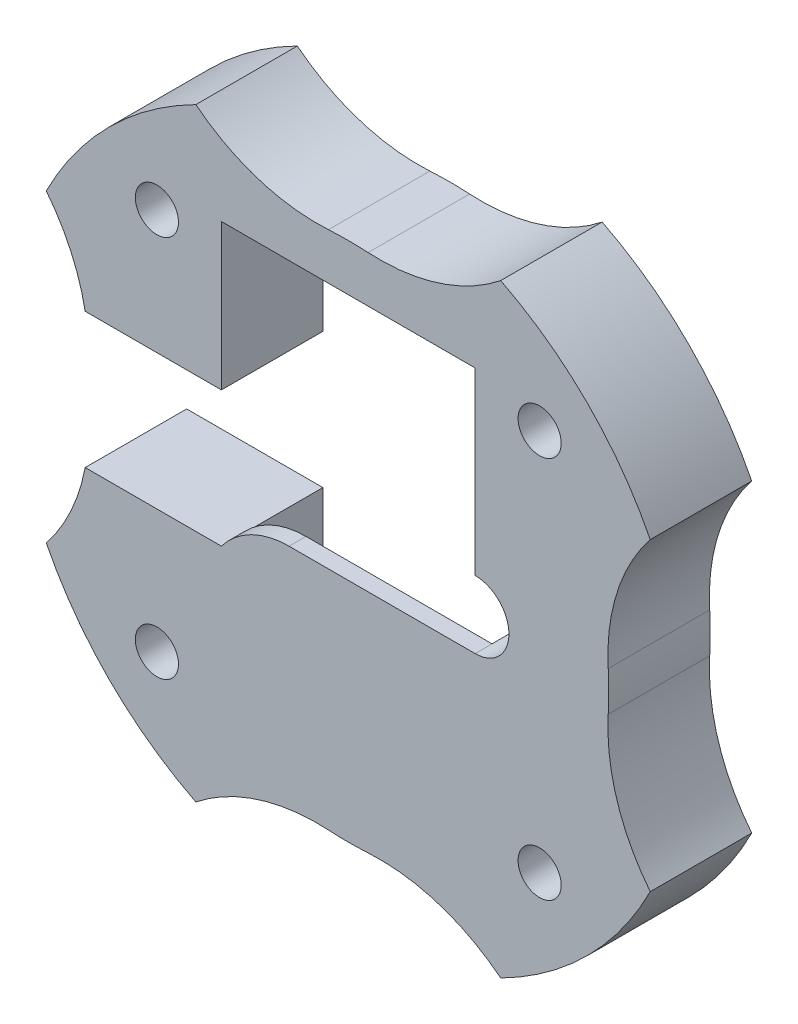
ISO-10303-21;
HEADER;
FILE_DESCRIPTION(('STEP AP214'),'2;1');
FILE_NAME('part.step','',(''),(''),'','','');
FILE_SCHEMA(('AUTOMOTIVE_DESIGN { 1 0 10303 214 1 1 1 1 }'));
ENDSEC;
DATA;
#1=APPLICATION_CONTEXT('core data for automotive mechanical design processes');
#2=APPLICATION_PROTOCOL_DEFINITION('international standard','automotive_design',2000,#1);
#3=PRODUCT_CONTEXT('',#1,'mechanical');
#4=PRODUCT('Part','Part','',(#3));
#5=PRODUCT_RELATED_PRODUCT_CATEGORY('part','',(#4));
#6=PRODUCT_DEFINITION_FORMATION('','',#4);
#7=PRODUCT_DEFINITION_CONTEXT('part definition',#1,'design');
#8=PRODUCT_DEFINITION('design','',#6,#7);
#9=PRODUCT_DEFINITION_SHAPE('','',#8);
#10=(LENGTH_UNIT() NAMED_UNIT(*) SI_UNIT(.MILLI.,.METRE.));
#11=(NAMED_UNIT(*) PLANE_ANGLE_UNIT() SI_UNIT($,.RADIAN.));
#12=(NAMED_UNIT(*) SI_UNIT($,.STERADIAN.) SOLID_ANGLE_UNIT());
#13=UNCERTAINTY_MEASURE_WITH_UNIT(LENGTH_MEASURE(1.E-05),#10,'distance_accuracy_value','');
#14=(GEOMETRIC_REPRESENTATION_CONTEXT(3) GLOBAL_UNCERTAINTY_ASSIGNED_CONTEXT((#13)) GLOBAL_UNIT_ASSIGNED_CONTEXT((#10,
#11,#12)) REPRESENTATION_CONTEXT('',''));
#15=CARTESIAN_POINT('',(0.,0.,0.));
#16=DIRECTION('',(0.,0.,1.));
#17=DIRECTION('',(1.,0.,0.));
#18=AXIS2_PLACEMENT_3D('',#15,#16,#17);
#19=CARTESIAN_POINT('',(-15.,245.749999993682,10.));
#20=DIRECTION('',(1.,0.,0.));
#21=DIRECTION('',(0.,1.,0.));
#22=AXIS2_PLACEMENT_3D('',#19,#20,#21);
#23=PLANE('',#22);
#24=DIRECTION('',(0.,-1.,0.));
#25=VECTOR('',#24,1.);
#26=CARTESIAN_POINT('',(-15.,245.749999993682,12.));
#27=LINE('',#26,#25);
#28=CARTESIAN_POINT('',(-15.,247.749999993682,12.));
#29=VERTEX_POINT('',#28);
#30=CARTESIAN_POINT('',(-15.,230.499999996841,12.));
#31=VERTEX_POINT('',#30);
#32=EDGE_CURVE('E476',#29,#31,#27,.T.);
#33=ORIENTED_EDGE('',*,*,#32,.T.);
#34=DIRECTION('',(0.,0.,-1.));
#35=VECTOR('',#34,1.);
#36=CARTESIAN_POINT('',(-15.,230.499999996841,19.));
#37=LINE('',#36,#35);
#38=CARTESIAN_POINT('',(-15.,230.499999996841,0.));
#39=VERTEX_POINT('',#38);
#40=EDGE_CURVE('E531',#31,#39,#37,.T.);
#41=ORIENTED_EDGE('',*,*,#40,.T.);
#42=DIRECTION('',(0.,-1.,0.));
#43=VECTOR('',#42,1.);
#44=CARTESIAN_POINT('',(-15.,245.749999993682,0.));
#45=LINE('',#44,#43);
#46=CARTESIAN_POINT('',(-15.,247.749999993682,0.));
#47=VERTEX_POINT('',#46);
#48=EDGE_CURVE('E267',#47,#39,#45,.T.);
#49=ORIENTED_EDGE('',*,*,#48,.F.);
#50=DIRECTION('',(0.,0.,1.));
#51=VECTOR('',#50,1.);
#52=CARTESIAN_POINT('',(-15.,247.749999993682,-23.));
#53=LINE('',#52,#51);
#54=EDGE_CURVE('E513',#47,#29,#53,.T.);
#55=ORIENTED_EDGE('',*,*,#54,.T.);
#56=EDGE_LOOP('',(#33,#41,#49,#55));
#57=FACE_BOUND('',#56,.T.);
#58=ADVANCED_FACE('F44',(#57),#23,.T.);
#59=CARTESIAN_POINT('',(26.8500979533182,220.651707524161,0.));
#60=DIRECTION('',(0.,0.,1.));
#61=DIRECTION('',(1.,0.,0.));
#62=AXIS2_PLACEMENT_3D('',#59,#60,#61);
#63=PLANE('',#62);
#64=CARTESIAN_POINT('',(-22.6274169979694,245.12741699481,0.));
#65=DIRECTION('',(0.,0.,1.));
#66=DIRECTION('',(1.,0.,0.));
#67=AXIS2_PLACEMENT_3D('',#64,#65,#66);
#68=CIRCLE('',#67,2.54999999999999);
#69=CARTESIAN_POINT('',(-20.0774169979694,245.12741699481,0.));
#70=VERTEX_POINT('',#69);
#71=EDGE_CURVE('E296',#70,#70,#68,.T.);
#72=ORIENTED_EDGE('',*,*,#71,.T.);
#73=EDGE_LOOP('',(#72));
#74=FACE_BOUND('',#73,.T.);
#75=CARTESIAN_POINT('',(-22.6274169979694,199.872582998871,0.));
#76=DIRECTION('',(0.,0.,1.));
#77=DIRECTION('',(1.,0.,0.));
#78=AXIS2_PLACEMENT_3D('',#75,#76,#77);
#79=CIRCLE('',#78,2.54999999999999);
#80=CARTESIAN_POINT('',(-20.0774169979694,199.872582998871,0.));
#81=VERTEX_POINT('',#80);
#82=EDGE_CURVE('E291',#81,#81,#79,.T.);
#83=ORIENTED_EDGE('',*,*,#82,.T.);
#84=EDGE_LOOP('',(#83));
#85=FACE_BOUND('',#84,.T.);
#86=CARTESIAN_POINT('',(22.6274169979694,199.872582998871,0.));
#87=DIRECTION('',(0.,0.,1.));
#88=DIRECTION('',(1.,0.,0.));
#89=AXIS2_PLACEMENT_3D('',#86,#87,#88);
#90=CIRCLE('',#89,2.55);
#91=CARTESIAN_POINT('',(25.1774169979694,199.872582998871,0.));
#92=VERTEX_POINT('',#91);
#93=EDGE_CURVE('E287',#92,#92,#90,.T.);
#94=ORIENTED_EDGE('',*,*,#93,.T.);
#95=EDGE_LOOP('',(#94));
#96=FACE_BOUND('',#95,.T.);
#97=CARTESIAN_POINT('',(22.6274169979694,245.127416994811,0.));
#98=DIRECTION('',(0.,0.,1.));
#99=DIRECTION('',(1.,0.,0.));
#100=AXIS2_PLACEMENT_3D('',#97,#98,#99);
#101=CIRCLE('',#100,2.55);
#102=CARTESIAN_POINT('',(25.1774169979694,245.127416994811,0.));
#103=VERTEX_POINT('',#102);
#104=EDGE_CURVE('E282',#103,#103,#101,.T.);
#105=ORIENTED_EDGE('',*,*,#104,.T.);
#106=EDGE_LOOP('',(#105));
#107=FACE_BOUND('',#106,.T.);
#108=DIRECTION('',(-1.,0.,0.));
#109=VECTOR('',#108,1.);
#110=CARTESIAN_POINT('',(-34.8095316654971,214.499999996841,0.));
#111=LINE('',#110,#109);
#112=CARTESIAN_POINT('',(-15.,214.499999996841,0.));
#113=VERTEX_POINT('',#112);
#114=CARTESIAN_POINT('',(-31.1071825324666,214.499999996841,0.));
#115=VERTEX_POINT('',#114);
#116=EDGE_CURVE('E222',#113,#115,#111,.T.);
#117=ORIENTED_EDGE('',*,*,#116,.F.);
#118=DIRECTION('',(0.,-1.,0.));
#119=VECTOR('',#118,1.);
#120=CARTESIAN_POINT('',(-15.,218.499999996841,0.));
#121=LINE('',#120,#119);
#122=CARTESIAN_POINT('',(-15.,199.25,0.));
#123=VERTEX_POINT('',#122);
#124=EDGE_CURVE('E232',#113,#123,#121,.T.);
#125=ORIENTED_EDGE('',*,*,#124,.T.);
#126=DIRECTION('',(1.,0.,0.));
#127=VECTOR('',#126,1.);
#128=CARTESIAN_POINT('',(-15.,199.25,0.));
#129=LINE('',#128,#127);
#130=CARTESIAN_POINT('',(15.,199.25,0.));
#131=VERTEX_POINT('',#130);
#132=EDGE_CURVE('E242',#123,#131,#129,.T.);
#133=ORIENTED_EDGE('',*,*,#132,.T.);
#134=DIRECTION('',(0.,1.,0.));
#135=VECTOR('',#134,1.);
#136=CARTESIAN_POINT('',(15.,199.25,0.));
#137=LINE('',#136,#135);
#138=CARTESIAN_POINT('',(15.,218.499999996841,0.));
#139=VERTEX_POINT('',#138);
#140=EDGE_CURVE('E249',#131,#139,#137,.T.);
#141=ORIENTED_EDGE('',*,*,#140,.T.);
#142=CARTESIAN_POINT('',(15.,222.499999996841,0.));
#143=DIRECTION('',(0.,0.,1.));
#144=DIRECTION('',(1.,0.,0.));
#145=AXIS2_PLACEMENT_3D('',#142,#143,#144);
#146=CIRCLE('',#145,4.);
#147=CARTESIAN_POINT('',(15.,226.499999996841,0.));
#148=VERTEX_POINT('',#147);
#149=EDGE_CURVE('E265',#139,#148,#146,.T.);
#150=ORIENTED_EDGE('',*,*,#149,.T.);
#151=DIRECTION('',(0.,1.,0.));
#152=VECTOR('',#151,1.);
#153=CARTESIAN_POINT('',(15.,226.499999996841,0.));
#154=LINE('',#153,#152);
#155=CARTESIAN_POINT('',(15.,247.749999993682,0.));
#156=VERTEX_POINT('',#155);
#157=EDGE_CURVE('E266',#148,#156,#154,.T.);
#158=ORIENTED_EDGE('',*,*,#157,.T.);
#159=DIRECTION('',(-1.,0.,0.));
#160=VECTOR('',#159,1.);
#161=CARTESIAN_POINT('',(26.8500979533182,247.749999993682,0.));
#162=LINE('',#161,#160);
#163=EDGE_CURVE('E512',#156,#47,#162,.T.);
#164=ORIENTED_EDGE('',*,*,#163,.T.);
#165=ORIENTED_EDGE('',*,*,#48,.T.);
#166=DIRECTION('',(1.,0.,0.));
#167=VECTOR('',#166,1.);
#168=CARTESIAN_POINT('',(-34.8095316654971,230.499999996841,0.));
#169=LINE('',#168,#167);
#170=CARTESIAN_POINT('',(-31.1071825324666,230.499999996841,0.));
#171=VERTEX_POINT('',#170);
#172=EDGE_CURVE('E230',#171,#39,#169,.T.);
#173=ORIENTED_EDGE('',*,*,#172,.F.);
#174=CARTESIAN_POINT('',(-53.7001959066365,226.1965849422,0.));
#175=DIRECTION('',(0.,0.,-1.));
#176=DIRECTION('',(1.,0.,0.));
#177=AXIS2_PLACEMENT_3D('',#174,#175,#176);
#178=CIRCLE('',#177,22.9992094311506);
#179=CARTESIAN_POINT('',(-35.7089622468441,240.524150885398,0.));
#180=VERTEX_POINT('',#179);
#181=EDGE_CURVE('E328',#180,#171,#178,.T.);
#182=ORIENTED_EDGE('',*,*,#181,.F.);
#183=CARTESIAN_POINT('',(0.,222.499999996841,0.));
#184=DIRECTION('',(0.,0.,1.));
#185=DIRECTION('',(1.,0.,0.));
#186=AXIS2_PLACEMENT_3D('',#183,#184,#185);
#187=CIRCLE('',#186,40.);
#188=CARTESIAN_POINT('',(-18.0241508885569,258.208962243685,0.));
#189=VERTEX_POINT('',#188);
#190=EDGE_CURVE('E326',#189,#180,#187,.T.);
#191=ORIENTED_EDGE('',*,*,#190,.F.);
#192=CARTESIAN_POINT('',(-3.69658494535899,276.200195903477,0.));
#193=DIRECTION('',(0.,0.,-1.));
#194=DIRECTION('',(1.,0.,0.));
#195=AXIS2_PLACEMENT_3D('',#192,#193,#194);
#196=CIRCLE('',#195,22.9992094311506);
#197=CARTESIAN_POINT('',(-2.34706751321945,253.240613216541,0.));
#198=VERTEX_POINT('',#197);
#199=EDGE_CURVE('E323',#198,#189,#196,.T.);
#200=ORIENTED_EDGE('',*,*,#199,.F.);
#201=CARTESIAN_POINT('',(0.,213.309531662338,0.));
#202=DIRECTION('',(0.,0.,1.));
#203=DIRECTION('',(1.,0.,0.));
#204=AXIS2_PLACEMENT_3D('',#201,#202,#203);
#205=CIRCLE('',#204,40.);
#206=CARTESIAN_POINT('',(2.34706751321958,253.240613216541,0.));
#207=VERTEX_POINT('',#206);
#208=EDGE_CURVE('E319',#207,#198,#205,.T.);
#209=ORIENTED_EDGE('',*,*,#208,.F.);
#210=CARTESIAN_POINT('',(3.69658494535932,276.200195903477,0.));
#211=DIRECTION('',(0.,0.,-1.));
#212=DIRECTION('',(1.,0.,0.));
#213=AXIS2_PLACEMENT_3D('',#210,#211,#212);
#214=CIRCLE('',#213,22.9992094311507);
#215=CARTESIAN_POINT('',(18.0241508885571,258.208962243685,0.));
#216=VERTEX_POINT('',#215);
#217=EDGE_CURVE('E320',#216,#207,#214,.T.);
#218=ORIENTED_EDGE('',*,*,#217,.F.);
#219=CARTESIAN_POINT('',(0.,222.499999996841,0.));
#220=DIRECTION('',(0.,0.,1.));
#221=DIRECTION('',(1.,0.,0.));
#222=AXIS2_PLACEMENT_3D('',#219,#220,#221);
#223=CIRCLE('',#222,40.);
#224=CARTESIAN_POINT('',(35.708962246844,240.524150885398,0.));
#225=VERTEX_POINT('',#224);
#226=EDGE_CURVE('E314',#225,#216,#223,.T.);
#227=ORIENTED_EDGE('',*,*,#226,.F.);
#228=CARTESIAN_POINT('',(53.7001959066364,226.1965849422,0.));
#229=DIRECTION('',(0.,0.,-1.));
#230=DIRECTION('',(1.,0.,0.));
#231=AXIS2_PLACEMENT_3D('',#228,#229,#230);
#232=CIRCLE('',#231,22.9992094311506);
#233=CARTESIAN_POINT('',(30.7406132196998,224.84706751006,0.));
#234=VERTEX_POINT('',#233);
#235=EDGE_CURVE('E313',#234,#225,#232,.T.);
#236=ORIENTED_EDGE('',*,*,#235,.F.);
#237=CARTESIAN_POINT('',(-9.19046833450298,222.499999996841,0.));
#238=DIRECTION('',(0.,0.,1.));
#239=DIRECTION('',(1.,0.,0.));
#240=AXIS2_PLACEMENT_3D('',#237,#238,#239);
#241=CIRCLE('',#240,40.);
#242=CARTESIAN_POINT('',(30.7406132196998,220.152932483621,0.));
#243=VERTEX_POINT('',#242);
#244=EDGE_CURVE('E306',#243,#234,#241,.T.);
#245=ORIENTED_EDGE('',*,*,#244,.F.);
#246=CARTESIAN_POINT('',(53.7001959066364,218.803415051482,0.));
#247=DIRECTION('',(0.,0.,-1.));
#248=DIRECTION('',(1.,0.,0.));
#249=AXIS2_PLACEMENT_3D('',#246,#247,#248);
#250=CIRCLE('',#249,22.9992094311507);
#251=CARTESIAN_POINT('',(35.708962246844,204.475849108284,0.));
#252=VERTEX_POINT('',#251);
#253=EDGE_CURVE('E304',#252,#243,#250,.T.);
#254=ORIENTED_EDGE('',*,*,#253,.F.);
#255=CARTESIAN_POINT('',(0.,222.499999996841,0.));
#256=DIRECTION('',(0.,0.,1.));
#257=DIRECTION('',(1.,0.,0.));
#258=AXIS2_PLACEMENT_3D('',#255,#256,#257);
#259=CIRCLE('',#258,40.);
#260=CARTESIAN_POINT('',(18.0241508885566,186.791037749997,0.));
#261=VERTEX_POINT('',#260);
#262=EDGE_CURVE('E301',#261,#252,#259,.T.);
#263=ORIENTED_EDGE('',*,*,#262,.F.);
#264=CARTESIAN_POINT('',(3.69658494535857,168.799804090204,0.));
#265=DIRECTION('',(0.,0.,-1.));
#266=DIRECTION('',(1.,0.,0.));
#267=AXIS2_PLACEMENT_3D('',#264,#265,#266);
#268=CIRCLE('',#267,22.9992094311506);
#269=CARTESIAN_POINT('',(2.34706751321916,191.759386777141,0.));
#270=VERTEX_POINT('',#269);
#271=EDGE_CURVE('E342',#270,#261,#268,.T.);
#272=ORIENTED_EDGE('',*,*,#271,.F.);
#273=CARTESIAN_POINT('',(0.,231.690468331344,0.));
#274=DIRECTION('',(0.,0.,1.));
#275=DIRECTION('',(1.,0.,0.));
#276=AXIS2_PLACEMENT_3D('',#273,#274,#275);
#277=CIRCLE('',#276,40.);
#278=CARTESIAN_POINT('',(-2.34706751321987,191.759386777141,0.));
#279=VERTEX_POINT('',#278);
#280=EDGE_CURVE('E341',#279,#270,#277,.T.);
#281=ORIENTED_EDGE('',*,*,#280,.F.);
#282=CARTESIAN_POINT('',(-3.69658494535974,168.799804090204,0.));
#283=DIRECTION('',(0.,0.,-1.));
#284=DIRECTION('',(1.,0.,0.));
#285=AXIS2_PLACEMENT_3D('',#282,#283,#284);
#286=CIRCLE('',#285,22.9992094311506);
#287=CARTESIAN_POINT('',(-18.0241508885574,186.791037749997,0.));
#288=VERTEX_POINT('',#287);
#289=EDGE_CURVE('E340',#288,#279,#286,.T.);
#290=ORIENTED_EDGE('',*,*,#289,.F.);
#291=CARTESIAN_POINT('',(0.,222.499999996841,0.));
#292=DIRECTION('',(0.,0.,1.));
#293=DIRECTION('',(1.,0.,0.));
#294=AXIS2_PLACEMENT_3D('',#291,#292,#293);
#295=CIRCLE('',#294,40.);
#296=CARTESIAN_POINT('',(-35.7089622468441,204.475849108284,0.));
#297=VERTEX_POINT('',#296);
#298=EDGE_CURVE('E333',#297,#288,#295,.T.);
#299=ORIENTED_EDGE('',*,*,#298,.F.);
#300=CARTESIAN_POINT('',(-53.7001959066365,218.803415051482,0.));
#301=DIRECTION('',(0.,0.,-1.));
#302=DIRECTION('',(1.,0.,0.));
#303=AXIS2_PLACEMENT_3D('',#300,#301,#302);
#304=CIRCLE('',#303,22.9992094311506);
#305=EDGE_CURVE('E240',#115,#297,#304,.T.);
#306=ORIENTED_EDGE('',*,*,#305,.F.);
#307=EDGE_LOOP('',(#117,#125,#133,#141,#150,#158,#164,#165,#173,#182,#191,#200,#209,#218,#227,
#236,#245,#254,#263,#272,#281,#290,#299,#306));
#308=FACE_BOUND('',#307,.T.);
#309=ADVANCED_FACE('F235',(#74,#85,#96,#107,#308),#63,.F.);
#310=CARTESIAN_POINT('',(0.,222.499999996841,10.));
#311=DIRECTION('',(0.,0.,-1.));
#312=DIRECTION('',(-1.,0.,0.));
#313=AXIS2_PLACEMENT_3D('',#310,#311,#312);
#314=CYLINDRICAL_SURFACE('',#313,40.);
#315=ORIENTED_EDGE('',*,*,#262,.T.);
#316=DIRECTION('',(0.,0.,-1.));
#317=VECTOR('',#316,1.);
#318=CARTESIAN_POINT('',(35.708962246844,204.475849108284,10.));
#319=LINE('',#318,#317);
#320=CARTESIAN_POINT('',(35.708962246844,204.475849108284,12.));
#321=VERTEX_POINT('',#320);
#322=EDGE_CURVE('E397',#321,#252,#319,.T.);
#323=ORIENTED_EDGE('',*,*,#322,.F.);
#324=CARTESIAN_POINT('',(0.,222.499999996841,12.));
#325=DIRECTION('',(0.,0.,1.));
#326=DIRECTION('',(1.,0.,0.));
#327=AXIS2_PLACEMENT_3D('',#324,#325,#326);
#328=CIRCLE('',#327,40.);
#329=CARTESIAN_POINT('',(18.0241508885566,186.791037749997,12.));
#330=VERTEX_POINT('',#329);
#331=EDGE_CURVE('E466',#330,#321,#328,.T.);
#332=ORIENTED_EDGE('',*,*,#331,.F.);
#333=DIRECTION('',(0.,0.,-1.));
#334=VECTOR('',#333,1.);
#335=CARTESIAN_POINT('',(18.0241508885566,186.791037749997,10.));
#336=LINE('',#335,#334);
#337=EDGE_CURVE('E350',#330,#261,#336,.T.);
#338=ORIENTED_EDGE('',*,*,#337,.T.);
#339=EDGE_LOOP('',(#315,#323,#332,#338));
#340=FACE_BOUND('',#339,.T.);
#341=ADVANCED_FACE('F600',(#340),#314,.T.);
#342=CARTESIAN_POINT('',(53.7001959066364,218.803415051482,10.));
#343=DIRECTION('',(0.,0.,-1.));
#344=DIRECTION('',(-1.,0.,0.));
#345=AXIS2_PLACEMENT_3D('',#342,#343,#344);
#346=CYLINDRICAL_SURFACE('',#345,22.9992094311507);
#347=ORIENTED_EDGE('',*,*,#253,.T.);
#348=DIRECTION('',(0.,0.,-1.));
#349=VECTOR('',#348,1.);
#350=CARTESIAN_POINT('',(30.7406132196998,220.152932483621,10.));
#351=LINE('',#350,#349);
#352=CARTESIAN_POINT('',(30.7406132196997,220.152932483621,12.));
#353=VERTEX_POINT('',#352);
#354=EDGE_CURVE('E392',#353,#243,#351,.T.);
#355=ORIENTED_EDGE('',*,*,#354,.F.);
#356=CARTESIAN_POINT('',(53.7001959066364,218.803415051482,12.));
#357=DIRECTION('',(0.,0.,-1.));
#358=DIRECTION('',(1.,0.,0.));
#359=AXIS2_PLACEMENT_3D('',#356,#357,#358);
#360=CIRCLE('',#359,22.9992094311507);
#361=EDGE_CURVE('E461',#321,#353,#360,.T.);
#362=ORIENTED_EDGE('',*,*,#361,.F.);
#363=ORIENTED_EDGE('',*,*,#322,.T.);
#364=EDGE_LOOP('',(#347,#355,#362,#363));
#365=FACE_BOUND('',#364,.T.);
#366=ADVANCED_FACE('F593',(#365),#346,.F.);
#367=CARTESIAN_POINT('',(-9.19046833450298,222.499999996841,10.));
#368=DIRECTION('',(0.,0.,-1.));
#369=DIRECTION('',(-1.,0.,0.));
#370=AXIS2_PLACEMENT_3D('',#367,#368,#369);
#371=CYLINDRICAL_SURFACE('',#370,40.);
#372=ORIENTED_EDGE('',*,*,#244,.T.);
#373=DIRECTION('',(0.,0.,-1.));
#374=VECTOR('',#373,1.);
#375=CARTESIAN_POINT('',(30.7406132196998,224.84706751006,10.));
#376=LINE('',#375,#374);
#377=CARTESIAN_POINT('',(30.7406132196997,224.84706751006,12.));
#378=VERTEX_POINT('',#377);
#379=EDGE_CURVE('E394',#378,#234,#376,.T.);
#380=ORIENTED_EDGE('',*,*,#379,.F.);
#381=CARTESIAN_POINT('',(-9.19046833450298,222.499999996841,12.));
#382=DIRECTION('',(0.,0.,1.));
#383=DIRECTION('',(1.,0.,0.));
#384=AXIS2_PLACEMENT_3D('',#381,#382,#383);
#385=CIRCLE('',#384,40.);
#386=EDGE_CURVE('E456',#353,#378,#385,.T.);
#387=ORIENTED_EDGE('',*,*,#386,.F.);
#388=ORIENTED_EDGE('',*,*,#354,.T.);
#389=EDGE_LOOP('',(#372,#380,#387,#388));
#390=FACE_BOUND('',#389,.T.);
#391=ADVANCED_FACE('F587',(#390),#371,.T.);
#392=CARTESIAN_POINT('',(53.7001959066364,226.1965849422,10.));
#393=DIRECTION('',(0.,0.,-1.));
#394=DIRECTION('',(-1.,0.,0.));
#395=AXIS2_PLACEMENT_3D('',#392,#393,#394);
#396=CYLINDRICAL_SURFACE('',#395,22.9992094311506);
#397=ORIENTED_EDGE('',*,*,#235,.T.);
#398=DIRECTION('',(0.,0.,-1.));
#399=VECTOR('',#398,1.);
#400=CARTESIAN_POINT('',(35.708962246844,240.524150885398,10.));
#401=LINE('',#400,#399);
#402=CARTESIAN_POINT('',(35.708962246844,240.524150885398,12.));
#403=VERTEX_POINT('',#402);
#404=EDGE_CURVE('E390',#403,#225,#401,.T.);
#405=ORIENTED_EDGE('',*,*,#404,.F.);
#406=CARTESIAN_POINT('',(53.7001959066364,226.1965849422,12.));
#407=DIRECTION('',(0.,0.,-1.));
#408=DIRECTION('',(1.,0.,0.));
#409=AXIS2_PLACEMENT_3D('',#406,#407,#408);
#410=CIRCLE('',#409,22.9992094311506);
#411=EDGE_CURVE('E452',#378,#403,#410,.T.);
#412=ORIENTED_EDGE('',*,*,#411,.F.);
#413=ORIENTED_EDGE('',*,*,#379,.T.);
#414=EDGE_LOOP('',(#397,#405,#412,#413));
#415=FACE_BOUND('',#414,.T.);
#416=ADVANCED_FACE('F588',(#415),#396,.F.);
#417=CARTESIAN_POINT('',(0.,222.499999996841,10.));
#418=DIRECTION('',(0.,0.,-1.));
#419=DIRECTION('',(-1.,0.,0.));
#420=AXIS2_PLACEMENT_3D('',#417,#418,#419);
#421=CYLINDRICAL_SURFACE('',#420,40.);
#422=ORIENTED_EDGE('',*,*,#226,.T.);
#423=DIRECTION('',(0.,0.,-1.));
#424=VECTOR('',#423,1.);
#425=CARTESIAN_POINT('',(18.0241508885571,258.208962243685,10.));
#426=LINE('',#425,#424);
#427=CARTESIAN_POINT('',(18.0241508885571,258.208962243685,12.));
#428=VERTEX_POINT('',#427);
#429=EDGE_CURVE('E382',#428,#216,#426,.T.);
#430=ORIENTED_EDGE('',*,*,#429,.F.);
#431=CARTESIAN_POINT('',(0.,222.499999996841,12.));
#432=DIRECTION('',(0.,0.,1.));
#433=DIRECTION('',(1.,0.,0.));
#434=AXIS2_PLACEMENT_3D('',#431,#432,#433);
#435=CIRCLE('',#434,40.);
#436=EDGE_CURVE('E447',#403,#428,#435,.T.);
#437=ORIENTED_EDGE('',*,*,#436,.F.);
#438=ORIENTED_EDGE('',*,*,#404,.T.);
#439=EDGE_LOOP('',(#422,#430,#437,#438));
#440=FACE_BOUND('',#439,.T.);
#441=ADVANCED_FACE('F582',(#440),#421,.T.);
#442=CARTESIAN_POINT('',(3.69658494535932,276.200195903477,10.));
#443=DIRECTION('',(0.,0.,-1.));
#444=DIRECTION('',(-1.,0.,0.));
#445=AXIS2_PLACEMENT_3D('',#442,#443,#444);
#446=CYLINDRICAL_SURFACE('',#445,22.9992094311507);
#447=ORIENTED_EDGE('',*,*,#217,.T.);
#448=DIRECTION('',(0.,0.,-1.));
#449=VECTOR('',#448,1.);
#450=CARTESIAN_POINT('',(2.34706751321958,253.240613216541,10.));
#451=LINE('',#450,#449);
#452=CARTESIAN_POINT('',(2.34706751321957,253.240613216541,12.));
#453=VERTEX_POINT('',#452);
#454=EDGE_CURVE('E377',#453,#207,#451,.T.);
#455=ORIENTED_EDGE('',*,*,#454,.F.);
#456=CARTESIAN_POINT('',(3.69658494535932,276.200195903477,12.));
#457=DIRECTION('',(0.,0.,-1.));
#458=DIRECTION('',(1.,0.,0.));
#459=AXIS2_PLACEMENT_3D('',#456,#457,#458);
#460=CIRCLE('',#459,22.9992094311507);
#461=EDGE_CURVE('E449',#428,#453,#460,.T.);
#462=ORIENTED_EDGE('',*,*,#461,.F.);
#463=ORIENTED_EDGE('',*,*,#429,.T.);
#464=EDGE_LOOP('',(#447,#455,#462,#463));
#465=FACE_BOUND('',#464,.T.);
#466=ADVANCED_FACE('F577',(#465),#446,.F.);
#467=CARTESIAN_POINT('',(0.,213.309531662338,10.));
#468=DIRECTION('',(0.,0.,-1.));
#469=DIRECTION('',(-1.,0.,0.));
#470=AXIS2_PLACEMENT_3D('',#467,#468,#469);
#471=CYLINDRICAL_SURFACE('',#470,40.);
#472=ORIENTED_EDGE('',*,*,#208,.T.);
#473=DIRECTION('',(0.,0.,-1.));
#474=VECTOR('',#473,1.);
#475=CARTESIAN_POINT('',(-2.34706751321945,253.240613216541,10.));
#476=LINE('',#475,#474);
#477=CARTESIAN_POINT('',(-2.34706751321945,253.240613216541,12.));
#478=VERTEX_POINT('',#477);
#479=EDGE_CURVE('E374',#478,#198,#476,.T.);
#480=ORIENTED_EDGE('',*,*,#479,.F.);
#481=CARTESIAN_POINT('',(0.,213.309531662338,12.));
#482=DIRECTION('',(0.,0.,1.));
#483=DIRECTION('',(1.,0.,0.));
#484=AXIS2_PLACEMENT_3D('',#481,#482,#483);
#485=CIRCLE('',#484,40.);
#486=EDGE_CURVE('E445',#453,#478,#485,.T.);
#487=ORIENTED_EDGE('',*,*,#486,.F.);
#488=ORIENTED_EDGE('',*,*,#454,.T.);
#489=EDGE_LOOP('',(#472,#480,#487,#488));
#490=FACE_BOUND('',#489,.T.);
#491=ADVANCED_FACE('F573',(#490),#471,.T.);
#492=CARTESIAN_POINT('',(-3.69658494535899,276.200195903477,10.));
#493=DIRECTION('',(0.,0.,-1.));
#494=DIRECTION('',(-1.,0.,0.));
#495=AXIS2_PLACEMENT_3D('',#492,#493,#494);
#496=CYLINDRICAL_SURFACE('',#495,22.9992094311506);
#497=ORIENTED_EDGE('',*,*,#199,.T.);
#498=DIRECTION('',(0.,0.,-1.));
#499=VECTOR('',#498,1.);
#500=CARTESIAN_POINT('',(-18.0241508885569,258.208962243685,10.));
#501=LINE('',#500,#499);
#502=CARTESIAN_POINT('',(-18.0241508885569,258.208962243685,12.));
#503=VERTEX_POINT('',#502);
#504=EDGE_CURVE('E371',#503,#189,#501,.T.);
#505=ORIENTED_EDGE('',*,*,#504,.F.);
#506=CARTESIAN_POINT('',(-3.69658494535899,276.200195903477,12.));
#507=DIRECTION('',(0.,0.,-1.));
#508=DIRECTION('',(1.,0.,0.));
#509=AXIS2_PLACEMENT_3D('',#506,#507,#508);
#510=CIRCLE('',#509,22.9992094311507);
#511=EDGE_CURVE('E437',#478,#503,#510,.T.);
#512=ORIENTED_EDGE('',*,*,#511,.F.);
#513=ORIENTED_EDGE('',*,*,#479,.T.);
#514=EDGE_LOOP('',(#497,#505,#512,#513));
#515=FACE_BOUND('',#514,.T.);
#516=ADVANCED_FACE('F568',(#515),#496,.F.);
#517=CARTESIAN_POINT('',(0.,222.499999996841,10.));
#518=DIRECTION('',(0.,0.,-1.));
#519=DIRECTION('',(-1.,0.,0.));
#520=AXIS2_PLACEMENT_3D('',#517,#518,#519);
#521=CYLINDRICAL_SURFACE('',#520,40.);
#522=ORIENTED_EDGE('',*,*,#190,.T.);
#523=DIRECTION('',(0.,0.,-1.));
#524=VECTOR('',#523,1.);
#525=CARTESIAN_POINT('',(-35.7089622468441,240.524150885398,10.));
#526=LINE('',#525,#524);
#527=CARTESIAN_POINT('',(-35.7089622468441,240.524150885398,12.));
#528=VERTEX_POINT('',#527);
#529=EDGE_CURVE('E370',#528,#180,#526,.T.);
#530=ORIENTED_EDGE('',*,*,#529,.F.);
#531=CARTESIAN_POINT('',(0.,222.499999996841,12.));
#532=DIRECTION('',(0.,0.,1.));
#533=DIRECTION('',(1.,0.,0.));
#534=AXIS2_PLACEMENT_3D('',#531,#532,#533);
#535=CIRCLE('',#534,40.);
#536=EDGE_CURVE('E432',#503,#528,#535,.T.);
#537=ORIENTED_EDGE('',*,*,#536,.F.);
#538=ORIENTED_EDGE('',*,*,#504,.T.);
#539=EDGE_LOOP('',(#522,#530,#537,#538));
#540=FACE_BOUND('',#539,.T.);
#541=ADVANCED_FACE('F567',(#540),#521,.T.);
#542=CARTESIAN_POINT('',(-53.7001959066365,226.1965849422,10.));
#543=DIRECTION('',(0.,0.,-1.));
#544=DIRECTION('',(-1.,0.,0.));
#545=AXIS2_PLACEMENT_3D('',#542,#543,#544);
#546=CYLINDRICAL_SURFACE('',#545,22.9992094311506);
#547=ORIENTED_EDGE('',*,*,#181,.T.);
#548=DIRECTION('',(0.,0.,-1.));
#549=VECTOR('',#548,1.);
#550=CARTESIAN_POINT('',(-31.1071825324666,230.499999996841,10.));
#551=LINE('',#550,#549);
#552=CARTESIAN_POINT('',(-31.1071825324666,230.499999996841,12.));
#553=VERTEX_POINT('',#552);
#554=EDGE_CURVE('E527',#171,#553,#551,.F.);
#555=ORIENTED_EDGE('',*,*,#554,.T.);
#556=CARTESIAN_POINT('',(-53.7001959066365,226.1965849422,12.));
#557=DIRECTION('',(0.,0.,-1.));
#558=DIRECTION('',(1.,0.,0.));
#559=AXIS2_PLACEMENT_3D('',#556,#557,#558);
#560=CIRCLE('',#559,22.9992094311506);
#561=EDGE_CURVE('E429',#528,#553,#560,.T.);
#562=ORIENTED_EDGE('',*,*,#561,.F.);
#563=ORIENTED_EDGE('',*,*,#529,.T.);
#564=EDGE_LOOP('',(#547,#555,#562,#563));
#565=FACE_BOUND('',#564,.T.);
#566=ADVANCED_FACE('F561',(#565),#546,.F.);
#567=CARTESIAN_POINT('',(-53.7001959066365,218.803415051482,10.));
#568=DIRECTION('',(0.,0.,-1.));
#569=DIRECTION('',(-1.,0.,0.));
#570=AXIS2_PLACEMENT_3D('',#567,#568,#569);
#571=CYLINDRICAL_SURFACE('',#570,22.9992094311506);
#572=CARTESIAN_POINT('',(-53.7001959066365,218.803415051482,12.));
#573=DIRECTION('',(0.,0.,-1.));
#574=DIRECTION('',(1.,0.,0.));
#575=AXIS2_PLACEMENT_3D('',#572,#573,#574);
#576=CIRCLE('',#575,22.9992094311506);
#577=CARTESIAN_POINT('',(-31.1071825324666,214.499999996841,12.));
#578=VERTEX_POINT('',#577);
#579=CARTESIAN_POINT('',(-35.7089622468441,204.475849108284,12.));
#580=VERTEX_POINT('',#579);
#581=EDGE_CURVE('E430',#578,#580,#576,.T.);
#582=ORIENTED_EDGE('',*,*,#581,.F.);
#583=DIRECTION('',(0.,0.,-1.));
#584=VECTOR('',#583,1.);
#585=CARTESIAN_POINT('',(-31.1071825324666,214.499999996841,10.));
#586=LINE('',#585,#584);
#587=EDGE_CURVE('E533',#578,#115,#586,.T.);
#588=ORIENTED_EDGE('',*,*,#587,.T.);
#589=ORIENTED_EDGE('',*,*,#305,.T.);
#590=DIRECTION('',(0.,0.,-1.));
#591=VECTOR('',#590,1.);
#592=CARTESIAN_POINT('',(-35.7089622468441,204.475849108284,10.));
#593=LINE('',#592,#591);
#594=EDGE_CURVE('E361',#580,#297,#593,.T.);
#595=ORIENTED_EDGE('',*,*,#594,.F.);
#596=EDGE_LOOP('',(#582,#588,#589,#595));
#597=FACE_BOUND('',#596,.T.);
#598=ADVANCED_FACE('F612',(#597),#571,.F.);
#599=CARTESIAN_POINT('',(0.,222.499999996841,10.));
#600=DIRECTION('',(0.,0.,-1.));
#601=DIRECTION('',(-1.,0.,0.));
#602=AXIS2_PLACEMENT_3D('',#599,#600,#601);
#603=CYLINDRICAL_SURFACE('',#602,40.);
#604=ORIENTED_EDGE('',*,*,#298,.T.);
#605=DIRECTION('',(0.,0.,-1.));
#606=VECTOR('',#605,1.);
#607=CARTESIAN_POINT('',(-18.0241508885574,186.791037749997,10.));
#608=LINE('',#607,#606);
#609=CARTESIAN_POINT('',(-18.0241508885574,186.791037749997,12.));
#610=VERTEX_POINT('',#609);
#611=EDGE_CURVE('E357',#610,#288,#608,.T.);
#612=ORIENTED_EDGE('',*,*,#611,.F.);
#613=CARTESIAN_POINT('',(0.,222.499999996841,12.));
#614=DIRECTION('',(0.,0.,1.));
#615=DIRECTION('',(1.,0.,0.));
#616=AXIS2_PLACEMENT_3D('',#613,#614,#615);
#617=CIRCLE('',#616,40.);
#618=EDGE_CURVE('E421',#580,#610,#617,.T.);
#619=ORIENTED_EDGE('',*,*,#618,.F.);
#620=ORIENTED_EDGE('',*,*,#594,.T.);
#621=EDGE_LOOP('',(#604,#612,#619,#620));
#622=FACE_BOUND('',#621,.T.);
#623=ADVANCED_FACE('F614',(#622),#603,.T.);
#624=CARTESIAN_POINT('',(-3.69658494535974,168.799804090204,10.));
#625=DIRECTION('',(0.,0.,-1.));
#626=DIRECTION('',(-1.,0.,0.));
#627=AXIS2_PLACEMENT_3D('',#624,#625,#626);
#628=CYLINDRICAL_SURFACE('',#627,22.9992094311506);
#629=ORIENTED_EDGE('',*,*,#289,.T.);
#630=DIRECTION('',(0.,0.,-1.));
#631=VECTOR('',#630,1.);
#632=CARTESIAN_POINT('',(-2.34706751321987,191.759386777141,10.));
#633=LINE('',#632,#631);
#634=CARTESIAN_POINT('',(-2.34706751321987,191.759386777141,12.));
#635=VERTEX_POINT('',#634);
#636=EDGE_CURVE('E352',#635,#279,#633,.T.);
#637=ORIENTED_EDGE('',*,*,#636,.F.);
#638=CARTESIAN_POINT('',(-3.69658494535974,168.799804090204,12.));
#639=DIRECTION('',(0.,0.,-1.));
#640=DIRECTION('',(1.,0.,0.));
#641=AXIS2_PLACEMENT_3D('',#638,#639,#640);
#642=CIRCLE('',#641,22.9992094311506);
#643=EDGE_CURVE('E251',#610,#635,#642,.T.);
#644=ORIENTED_EDGE('',*,*,#643,.F.);
#645=ORIENTED_EDGE('',*,*,#611,.T.);
#646=EDGE_LOOP('',(#629,#637,#644,#645));
#647=FACE_BOUND('',#646,.T.);
#648=ADVANCED_FACE('F606',(#647),#628,.F.);
#649=CARTESIAN_POINT('',(0.,231.690468331344,10.));
#650=DIRECTION('',(0.,0.,-1.));
#651=DIRECTION('',(-1.,0.,0.));
#652=AXIS2_PLACEMENT_3D('',#649,#650,#651);
#653=CYLINDRICAL_SURFACE('',#652,40.);
#654=ORIENTED_EDGE('',*,*,#280,.T.);
#655=DIRECTION('',(0.,0.,-1.));
#656=VECTOR('',#655,1.);
#657=CARTESIAN_POINT('',(2.34706751321916,191.759386777141,10.));
#658=LINE('',#657,#656);
#659=CARTESIAN_POINT('',(2.34706751321915,191.759386777141,12.));
#660=VERTEX_POINT('',#659);
#661=EDGE_CURVE('E354',#660,#270,#658,.T.);
#662=ORIENTED_EDGE('',*,*,#661,.F.);
#663=CARTESIAN_POINT('',(0.,231.690468331344,12.));
#664=DIRECTION('',(0.,0.,1.));
#665=DIRECTION('',(1.,0.,0.));
#666=AXIS2_PLACEMENT_3D('',#663,#664,#665);
#667=CIRCLE('',#666,40.);
#668=EDGE_CURVE('E246',#635,#660,#667,.T.);
#669=ORIENTED_EDGE('',*,*,#668,.F.);
#670=ORIENTED_EDGE('',*,*,#636,.T.);
#671=EDGE_LOOP('',(#654,#662,#669,#670));
#672=FACE_BOUND('',#671,.T.);
#673=ADVANCED_FACE('F604',(#672),#653,.T.);
#674=CARTESIAN_POINT('',(3.69658494535857,168.799804090204,10.));
#675=DIRECTION('',(0.,0.,-1.));
#676=DIRECTION('',(-1.,0.,0.));
#677=AXIS2_PLACEMENT_3D('',#674,#675,#676);
#678=CYLINDRICAL_SURFACE('',#677,22.9992094311506);
#679=ORIENTED_EDGE('',*,*,#271,.T.);
#680=ORIENTED_EDGE('',*,*,#337,.F.);
#681=CARTESIAN_POINT('',(3.69658494535857,168.799804090204,12.));
#682=DIRECTION('',(0.,0.,-1.));
#683=DIRECTION('',(1.,0.,0.));
#684=AXIS2_PLACEMENT_3D('',#681,#682,#683);
#685=CIRCLE('',#684,22.9992094311506);
#686=EDGE_CURVE('E469',#660,#330,#685,.T.);
#687=ORIENTED_EDGE('',*,*,#686,.F.);
#688=ORIENTED_EDGE('',*,*,#661,.T.);
#689=EDGE_LOOP('',(#679,#680,#687,#688));
#690=FACE_BOUND('',#689,.T.);
#691=ADVANCED_FACE('F605',(#690),#678,.F.);
#692=CARTESIAN_POINT('',(-22.6274169979694,245.12741699481,10.));
#693=DIRECTION('',(0.,0.,-1.));
#694=DIRECTION('',(-1.,0.,0.));
#695=AXIS2_PLACEMENT_3D('',#692,#693,#694);
#696=CYLINDRICAL_SURFACE('',#695,2.54999999999999);
#697=ORIENTED_EDGE('',*,*,#71,.F.);
#698=EDGE_LOOP('',(#697));
#699=FACE_BOUND('',#698,.T.);
#700=CARTESIAN_POINT('',(-22.6274169979694,245.12741699481,12.));
#701=DIRECTION('',(0.,0.,1.));
#702=DIRECTION('',(1.,0.,0.));
#703=AXIS2_PLACEMENT_3D('',#700,#701,#702);
#704=CIRCLE('',#703,2.54999999999999);
#705=CARTESIAN_POINT('',(-20.0774169979694,245.12741699481,12.));
#706=VERTEX_POINT('',#705);
#707=EDGE_CURVE('E483',#706,#706,#704,.T.);
#708=ORIENTED_EDGE('',*,*,#707,.T.);
#709=EDGE_LOOP('',(#708));
#710=FACE_BOUND('',#709,.T.);
#711=ADVANCED_FACE('F663',(#699,#710),#696,.F.);
#712=CARTESIAN_POINT('',(-22.6274169979694,199.872582998871,10.));
#713=DIRECTION('',(0.,0.,-1.));
#714=DIRECTION('',(-1.,0.,0.));
#715=AXIS2_PLACEMENT_3D('',#712,#713,#714);
#716=CYLINDRICAL_SURFACE('',#715,2.54999999999999);
#717=ORIENTED_EDGE('',*,*,#82,.F.);
#718=EDGE_LOOP('',(#717));
#719=FACE_BOUND('',#718,.T.);
#720=CARTESIAN_POINT('',(-22.6274169979694,199.872582998871,12.));
#721=DIRECTION('',(0.,0.,1.));
#722=DIRECTION('',(1.,0.,0.));
#723=AXIS2_PLACEMENT_3D('',#720,#721,#722);
#724=CIRCLE('',#723,2.54999999999999);
#725=CARTESIAN_POINT('',(-20.0774169979694,199.872582998871,12.));
#726=VERTEX_POINT('',#725);
#727=EDGE_CURVE('E496',#726,#726,#724,.T.);
#728=ORIENTED_EDGE('',*,*,#727,.T.);
#729=EDGE_LOOP('',(#728));
#730=FACE_BOUND('',#729,.T.);
#731=ADVANCED_FACE('F662',(#719,#730),#716,.F.);
#732=CARTESIAN_POINT('',(22.6274169979694,199.872582998871,10.));
#733=DIRECTION('',(0.,0.,-1.));
#734=DIRECTION('',(-1.,0.,0.));
#735=AXIS2_PLACEMENT_3D('',#732,#733,#734);
#736=CYLINDRICAL_SURFACE('',#735,2.55);
#737=ORIENTED_EDGE('',*,*,#93,.F.);
#738=EDGE_LOOP('',(#737));
#739=FACE_BOUND('',#738,.T.);
#740=CARTESIAN_POINT('',(22.6274169979694,199.872582998871,12.));
#741=DIRECTION('',(0.,0.,1.));
#742=DIRECTION('',(1.,0.,0.));
#743=AXIS2_PLACEMENT_3D('',#740,#741,#742);
#744=CIRCLE('',#743,2.54999999999999);
#745=CARTESIAN_POINT('',(25.1774169979694,199.872582998871,12.));
#746=VERTEX_POINT('',#745);
#747=EDGE_CURVE('E505',#746,#746,#744,.T.);
#748=ORIENTED_EDGE('',*,*,#747,.T.);
#749=EDGE_LOOP('',(#748));
#750=FACE_BOUND('',#749,.T.);
#751=ADVANCED_FACE('F660',(#739,#750),#736,.F.);
#752=CARTESIAN_POINT('',(22.6274169979694,245.127416994811,10.));
#753=DIRECTION('',(0.,0.,-1.));
#754=DIRECTION('',(-1.,0.,0.));
#755=AXIS2_PLACEMENT_3D('',#752,#753,#754);
#756=CYLINDRICAL_SURFACE('',#755,2.55);
#757=ORIENTED_EDGE('',*,*,#104,.F.);
#758=EDGE_LOOP('',(#757));
#759=FACE_BOUND('',#758,.T.);
#760=CARTESIAN_POINT('',(22.6274169979694,245.127416994811,12.));
#761=DIRECTION('',(0.,0.,1.));
#762=DIRECTION('',(1.,0.,0.));
#763=AXIS2_PLACEMENT_3D('',#760,#761,#762);
#764=CIRCLE('',#763,2.54999999999999);
#765=CARTESIAN_POINT('',(25.1774169979694,245.127416994811,12.));
#766=VERTEX_POINT('',#765);
#767=EDGE_CURVE('E510',#766,#766,#764,.T.);
#768=ORIENTED_EDGE('',*,*,#767,.T.);
#769=EDGE_LOOP('',(#768));
#770=FACE_BOUND('',#769,.T.);
#771=ADVANCED_FACE('F652',(#759,#770),#756,.F.);
#772=CARTESIAN_POINT('',(-15.,218.499999996841,10.));
#773=DIRECTION('',(1.,0.,0.));
#774=DIRECTION('',(0.,1.,0.));
#775=AXIS2_PLACEMENT_3D('',#772,#773,#774);
#776=PLANE('',#775);
#777=DIRECTION('',(0.,0.,-1.));
#778=VECTOR('',#777,1.);
#779=CARTESIAN_POINT('',(-15.,214.499999996841,19.));
#780=LINE('',#779,#778);
#781=CARTESIAN_POINT('',(-15.,214.499999996841,10.));
#782=VERTEX_POINT('',#781);
#783=EDGE_CURVE('E220',#782,#113,#780,.T.);
#784=ORIENTED_EDGE('',*,*,#783,.F.);
#785=DIRECTION('',(0.,-1.,0.));
#786=VECTOR('',#785,1.);
#787=CARTESIAN_POINT('',(-15.,218.499999996841,10.));
#788=LINE('',#787,#786);
#789=CARTESIAN_POINT('',(-15.,199.25,10.));
#790=VERTEX_POINT('',#789);
#791=EDGE_CURVE('E272',#782,#790,#788,.T.);
#792=ORIENTED_EDGE('',*,*,#791,.T.);
#793=DIRECTION('',(0.,0.,-1.));
#794=VECTOR('',#793,1.);
#795=CARTESIAN_POINT('',(-15.,199.25,10.));
#796=LINE('',#795,#794);
#797=EDGE_CURVE('E241',#790,#123,#796,.T.);
#798=ORIENTED_EDGE('',*,*,#797,.T.);
#799=ORIENTED_EDGE('',*,*,#124,.F.);
#800=EDGE_LOOP('',(#784,#792,#798,#799));
#801=FACE_BOUND('',#800,.T.);
#802=ADVANCED_FACE('F238',(#801),#776,.T.);
#803=CARTESIAN_POINT('',(-15.,199.25,10.));
#804=DIRECTION('',(0.,1.,0.));
#805=DIRECTION('',(0.,0.,1.));
#806=AXIS2_PLACEMENT_3D('',#803,#804,#805);
#807=PLANE('',#806);
#808=ORIENTED_EDGE('',*,*,#132,.F.);
#809=ORIENTED_EDGE('',*,*,#797,.F.);
#810=DIRECTION('',(1.,0.,0.));
#811=VECTOR('',#810,1.);
#812=CARTESIAN_POINT('',(-15.,199.25,10.));
#813=LINE('',#812,#811);
#814=CARTESIAN_POINT('',(15.,199.25,10.));
#815=VERTEX_POINT('',#814);
#816=EDGE_CURVE('E412',#790,#815,#813,.T.);
#817=ORIENTED_EDGE('',*,*,#816,.T.);
#818=DIRECTION('',(0.,0.,-1.));
#819=VECTOR('',#818,1.);
#820=CARTESIAN_POINT('',(15.,199.25,10.));
#821=LINE('',#820,#819);
#822=EDGE_CURVE('E278',#815,#131,#821,.T.);
#823=ORIENTED_EDGE('',*,*,#822,.T.);
#824=EDGE_LOOP('',(#808,#809,#817,#823));
#825=FACE_BOUND('',#824,.T.);
#826=ADVANCED_FACE('F650',(#825),#807,.T.);
#827=CARTESIAN_POINT('',(15.,199.25,10.));
#828=DIRECTION('',(-1.,0.,0.));
#829=DIRECTION('',(0.,-1.,0.));
#830=AXIS2_PLACEMENT_3D('',#827,#828,#829);
#831=PLANE('',#830);
#832=ORIENTED_EDGE('',*,*,#140,.F.);
#833=ORIENTED_EDGE('',*,*,#822,.F.);
#834=DIRECTION('',(0.,1.,0.));
#835=VECTOR('',#834,1.);
#836=CARTESIAN_POINT('',(15.,199.25,10.));
#837=LINE('',#836,#835);
#838=CARTESIAN_POINT('',(15.,218.499999996841,10.));
#839=VERTEX_POINT('',#838);
#840=EDGE_CURVE('E258',#815,#839,#837,.T.);
#841=ORIENTED_EDGE('',*,*,#840,.T.);
#842=DIRECTION('',(0.,0.,-1.));
#843=VECTOR('',#842,1.);
#844=CARTESIAN_POINT('',(15.,218.499999996841,10.));
#845=LINE('',#844,#843);
#846=EDGE_CURVE('E280',#839,#139,#845,.T.);
#847=ORIENTED_EDGE('',*,*,#846,.T.);
#848=EDGE_LOOP('',(#832,#833,#841,#847));
#849=FACE_BOUND('',#848,.T.);
#850=ADVANCED_FACE('F641',(#849),#831,.T.);
#851=CARTESIAN_POINT('',(15.,222.499999996841,10.));
#852=DIRECTION('',(0.,0.,-1.));
#853=DIRECTION('',(-1.,0.,0.));
#854=AXIS2_PLACEMENT_3D('',#851,#852,#853);
#855=CYLINDRICAL_SURFACE('',#854,4.);
#856=ORIENTED_EDGE('',*,*,#149,.F.);
#857=ORIENTED_EDGE('',*,*,#846,.F.);
#858=DIRECTION('',(0.,0.,-1.));
#859=VECTOR('',#858,1.);
#860=CARTESIAN_POINT('',(15.,218.499999996841,12.));
#861=LINE('',#860,#859);
#862=CARTESIAN_POINT('',(15.,218.499999996841,12.));
#863=VERTEX_POINT('',#862);
#864=EDGE_CURVE('E475',#863,#839,#861,.T.);
#865=ORIENTED_EDGE('',*,*,#864,.F.);
#866=CARTESIAN_POINT('',(15.,222.499999996841,12.));
#867=DIRECTION('',(0.,0.,1.));
#868=DIRECTION('',(1.,0.,0.));
#869=AXIS2_PLACEMENT_3D('',#866,#867,#868);
#870=CIRCLE('',#869,4.);
#871=CARTESIAN_POINT('',(15.,226.499999996841,12.));
#872=VERTEX_POINT('',#871);
#873=EDGE_CURVE('E489',#863,#872,#870,.T.);
#874=ORIENTED_EDGE('',*,*,#873,.T.);
#875=DIRECTION('',(0.,0.,-1.));
#876=VECTOR('',#875,1.);
#877=CARTESIAN_POINT('',(15.,226.499999996841,10.));
#878=LINE('',#877,#876);
#879=EDGE_CURVE('E273',#872,#148,#878,.T.);
#880=ORIENTED_EDGE('',*,*,#879,.T.);
#881=EDGE_LOOP('',(#856,#857,#865,#874,#880));
#882=FACE_BOUND('',#881,.T.);
#883=ADVANCED_FACE('F639',(#882),#855,.F.);
#884=CARTESIAN_POINT('',(15.,226.499999996841,10.));
#885=DIRECTION('',(-1.,0.,0.));
#886=DIRECTION('',(0.,-1.,0.));
#887=AXIS2_PLACEMENT_3D('',#884,#885,#886);
#888=PLANE('',#887);
#889=ORIENTED_EDGE('',*,*,#157,.F.);
#890=ORIENTED_EDGE('',*,*,#879,.F.);
#891=DIRECTION('',(0.,1.,0.));
#892=VECTOR('',#891,1.);
#893=CARTESIAN_POINT('',(15.,226.499999996841,12.));
#894=LINE('',#893,#892);
#895=CARTESIAN_POINT('',(15.,247.749999993682,12.));
#896=VERTEX_POINT('',#895);
#897=EDGE_CURVE('E490',#872,#896,#894,.T.);
#898=ORIENTED_EDGE('',*,*,#897,.T.);
#899=DIRECTION('',(0.,0.,1.));
#900=VECTOR('',#899,1.);
#901=CARTESIAN_POINT('',(15.,247.749999993682,-23.));
#902=LINE('',#901,#900);
#903=EDGE_CURVE('E519',#156,#896,#902,.T.);
#904=ORIENTED_EDGE('',*,*,#903,.F.);
#905=EDGE_LOOP('',(#889,#890,#898,#904));
#906=FACE_BOUND('',#905,.T.);
#907=ADVANCED_FACE('F554',(#906),#888,.T.);
#908=CARTESIAN_POINT('',(1.84829247267931,200.245136210774,12.));
#909=DIRECTION('',(0.,0.,1.));
#910=DIRECTION('',(1.,0.,0.));
#911=AXIS2_PLACEMENT_3D('',#908,#909,#910);
#912=PLANE('',#911);
#913=DIRECTION('',(1.,0.,0.));
#914=VECTOR('',#913,1.);
#915=CARTESIAN_POINT('',(-15.,218.499999996841,12.));
#916=LINE('',#915,#914);
#917=CARTESIAN_POINT('',(-7.00000000000004,218.499999996841,12.));
#918=VERTEX_POINT('',#917);
#919=EDGE_CURVE('E485',#918,#863,#916,.T.);
#920=ORIENTED_EDGE('',*,*,#919,.F.);
#921=CARTESIAN_POINT('',(-7.00000000000004,208.499999996841,12.));
#922=DIRECTION('',(0.,0.,1.));
#923=DIRECTION('',(1.,0.,0.));
#924=AXIS2_PLACEMENT_3D('',#921,#922,#923);
#925=CIRCLE('',#924,10.);
#926=CARTESIAN_POINT('',(-15.,214.499999996841,12.));
#927=VERTEX_POINT('',#926);
#928=EDGE_CURVE('E11',#918,#927,#925,.T.);
#929=ORIENTED_EDGE('',*,*,#928,.T.);
#930=DIRECTION('',(1.,0.,0.));
#931=VECTOR('',#930,1.);
#932=CARTESIAN_POINT('',(1.84829247267931,214.499999996841,12.));
#933=LINE('',#932,#931);
#934=EDGE_CURVE('E401',#578,#927,#933,.T.);
#935=ORIENTED_EDGE('',*,*,#934,.F.);
#936=ORIENTED_EDGE('',*,*,#581,.T.);
#937=ORIENTED_EDGE('',*,*,#618,.T.);
#938=ORIENTED_EDGE('',*,*,#643,.T.);
#939=ORIENTED_EDGE('',*,*,#668,.T.);
#940=ORIENTED_EDGE('',*,*,#686,.T.);
#941=ORIENTED_EDGE('',*,*,#331,.T.);
#942=ORIENTED_EDGE('',*,*,#361,.T.);
#943=ORIENTED_EDGE('',*,*,#386,.T.);
#944=ORIENTED_EDGE('',*,*,#411,.T.);
#945=ORIENTED_EDGE('',*,*,#436,.T.);
#946=ORIENTED_EDGE('',*,*,#461,.T.);
#947=ORIENTED_EDGE('',*,*,#486,.T.);
#948=ORIENTED_EDGE('',*,*,#511,.T.);
#949=ORIENTED_EDGE('',*,*,#536,.T.);
#950=ORIENTED_EDGE('',*,*,#561,.T.);
#951=DIRECTION('',(-1.,0.,0.));
#952=VECTOR('',#951,1.);
#953=CARTESIAN_POINT('',(1.84829247267931,230.499999996841,12.));
#954=LINE('',#953,#952);
#955=EDGE_CURVE('E409',#31,#553,#954,.T.);
#956=ORIENTED_EDGE('',*,*,#955,.F.);
#957=ORIENTED_EDGE('',*,*,#32,.F.);
#958=DIRECTION('',(-1.,0.,0.));
#959=VECTOR('',#958,1.);
#960=CARTESIAN_POINT('',(15.,247.749999993682,12.));
#961=LINE('',#960,#959);
#962=EDGE_CURVE('E517',#896,#29,#961,.T.);
#963=ORIENTED_EDGE('',*,*,#962,.F.);
#964=ORIENTED_EDGE('',*,*,#897,.F.);
#965=ORIENTED_EDGE('',*,*,#873,.F.);
#966=EDGE_LOOP('',(#920,#929,#935,#936,#937,#938,#939,#940,#941,#942,#943,#944,#945,#946,#947,
#948,#949,#950,#956,#957,#963,#964,#965));
#967=FACE_BOUND('',#966,.T.);
#968=ORIENTED_EDGE('',*,*,#747,.F.);
#969=EDGE_LOOP('',(#968));
#970=FACE_BOUND('',#969,.T.);
#971=ORIENTED_EDGE('',*,*,#707,.F.);
#972=EDGE_LOOP('',(#971));
#973=FACE_BOUND('',#972,.T.);
#974=ORIENTED_EDGE('',*,*,#727,.F.);
#975=EDGE_LOOP('',(#974));
#976=FACE_BOUND('',#975,.T.);
#977=ORIENTED_EDGE('',*,*,#767,.F.);
#978=EDGE_LOOP('',(#977));
#979=FACE_BOUND('',#978,.T.);
#980=ADVANCED_FACE('F556',(#967,#970,#973,#976,#979),#912,.T.);
#981=CARTESIAN_POINT('',(1.84829247267931,200.245136210774,10.));
#982=DIRECTION('',(0.,0.,1.));
#983=DIRECTION('',(1.,0.,0.));
#984=AXIS2_PLACEMENT_3D('',#981,#982,#983);
#985=PLANE('',#984);
#986=ORIENTED_EDGE('',*,*,#791,.F.);
#987=CARTESIAN_POINT('',(-7.00000000000004,208.499999996841,10.));
#988=DIRECTION('',(0.,0.,1.));
#989=DIRECTION('',(1.,0.,0.));
#990=AXIS2_PLACEMENT_3D('',#987,#988,#989);
#991=CIRCLE('',#990,10.);
#992=CARTESIAN_POINT('',(-7.00000000000004,218.499999996841,10.));
#993=VERTEX_POINT('',#992);
#994=EDGE_CURVE('E68',#782,#993,#991,.F.);
#995=ORIENTED_EDGE('',*,*,#994,.T.);
#996=DIRECTION('',(1.,0.,0.));
#997=VECTOR('',#996,1.);
#998=CARTESIAN_POINT('',(-15.,218.499999996841,10.));
#999=LINE('',#998,#997);
#1000=EDGE_CURVE('E479',#993,#839,#999,.T.);
#1001=ORIENTED_EDGE('',*,*,#1000,.T.);
#1002=ORIENTED_EDGE('',*,*,#840,.F.);
#1003=ORIENTED_EDGE('',*,*,#816,.F.);
#1004=EDGE_LOOP('',(#986,#995,#1001,#1002,#1003));
#1005=FACE_BOUND('',#1004,.T.);
#1006=ADVANCED_FACE('F638',(#1005),#985,.F.);
#1007=CARTESIAN_POINT('',(-15.,218.499999996841,12.));
#1008=DIRECTION('',(0.,1.,0.));
#1009=DIRECTION('',(0.,0.,1.));
#1010=AXIS2_PLACEMENT_3D('',#1007,#1008,#1009);
#1011=PLANE('',#1010);
#1012=ORIENTED_EDGE('',*,*,#1000,.F.);
#1013=DIRECTION('',(0.,0.,1.));
#1014=VECTOR('',#1013,1.);
#1015=CARTESIAN_POINT('',(-7.00000000000004,218.499999996841,12.));
#1016=LINE('',#1015,#1014);
#1017=EDGE_CURVE('E53',#993,#918,#1016,.T.);
#1018=ORIENTED_EDGE('',*,*,#1017,.T.);
#1019=ORIENTED_EDGE('',*,*,#919,.T.);
#1020=ORIENTED_EDGE('',*,*,#864,.T.);
#1021=EDGE_LOOP('',(#1012,#1018,#1019,#1020));
#1022=FACE_BOUND('',#1021,.T.);
#1023=ADVANCED_FACE('F807',(#1022),#1011,.T.);
#1024=CARTESIAN_POINT('',(15.,247.749999993682,-23.));
#1025=DIRECTION('',(0.,1.,0.));
#1026=DIRECTION('',(0.,0.,1.));
#1027=AXIS2_PLACEMENT_3D('',#1024,#1025,#1026);
#1028=PLANE('',#1027);
#1029=ORIENTED_EDGE('',*,*,#903,.T.);
#1030=ORIENTED_EDGE('',*,*,#962,.T.);
#1031=ORIENTED_EDGE('',*,*,#54,.F.);
#1032=ORIENTED_EDGE('',*,*,#163,.F.);
#1033=EDGE_LOOP('',(#1029,#1030,#1031,#1032));
#1034=FACE_BOUND('',#1033,.T.);
#1035=ADVANCED_FACE('F549',(#1034),#1028,.F.);
#1036=CARTESIAN_POINT('',(-34.8095316654971,214.499999996841,19.));
#1037=DIRECTION('',(0.,-1.,0.));
#1038=DIRECTION('',(0.,0.,-1.));
#1039=AXIS2_PLACEMENT_3D('',#1036,#1037,#1038);
#1040=PLANE('',#1039);
#1041=ORIENTED_EDGE('',*,*,#934,.T.);
#1042=EDGE_CURVE('E221',#927,#782,#780,.T.);
#1043=ORIENTED_EDGE('',*,*,#1042,.T.);
#1044=ORIENTED_EDGE('',*,*,#783,.T.);
#1045=ORIENTED_EDGE('',*,*,#116,.T.);
#1046=ORIENTED_EDGE('',*,*,#587,.F.);
#1047=EDGE_LOOP('',(#1041,#1043,#1044,#1045,#1046));
#1048=FACE_BOUND('',#1047,.T.);
#1049=ADVANCED_FACE('F219',(#1048),#1040,.F.);
#1050=CARTESIAN_POINT('',(-34.8095316654971,230.499999996841,19.));
#1051=DIRECTION('',(0.,1.,0.));
#1052=DIRECTION('',(0.,0.,1.));
#1053=AXIS2_PLACEMENT_3D('',#1050,#1051,#1052);
#1054=PLANE('',#1053);
#1055=ORIENTED_EDGE('',*,*,#172,.T.);
#1056=ORIENTED_EDGE('',*,*,#40,.F.);
#1057=ORIENTED_EDGE('',*,*,#955,.T.);
#1058=ORIENTED_EDGE('',*,*,#554,.F.);
#1059=EDGE_LOOP('',(#1055,#1056,#1057,#1058));
#1060=FACE_BOUND('',#1059,.T.);
#1061=ADVANCED_FACE('F541',(#1060),#1054,.F.);
#1062=CARTESIAN_POINT('',(-7.00000000000004,208.499999996841,19.));
#1063=DIRECTION('',(0.,0.,-1.));
#1064=DIRECTION('',(-1.,0.,0.));
#1065=AXIS2_PLACEMENT_3D('',#1062,#1063,#1064);
#1066=CYLINDRICAL_SURFACE('',#1065,10.);
#1067=ORIENTED_EDGE('',*,*,#928,.F.);
#1068=ORIENTED_EDGE('',*,*,#1017,.F.);
#1069=ORIENTED_EDGE('',*,*,#994,.F.);
#1070=ORIENTED_EDGE('',*,*,#1042,.F.);
#1071=EDGE_LOOP('',(#1067,#1068,#1069,#1070));
#1072=FACE_BOUND('',#1071,.T.);
#1073=ADVANCED_FACE('F50',(#1072),#1066,.T.);
#1074=CLOSED_SHELL('',(#58,#309,#341,#366,#391,#416,#441,#466,#491,#516,#541,#566,#598,#623,
#648,#673,#691,#711,#731,#751,#771,#802,#826,#850,#883,#907,#980,#1006,#1023,#1035,#1049,#1061,#1073));
#1075=MANIFOLD_SOLID_BREP('B2',#1074);
#1076=ADVANCED_BREP_SHAPE_REPRESENTATION('',(#18,#1075),#14);
#1077=SHAPE_DEFINITION_REPRESENTATION(#9,#1076);
ENDSEC;
END-ISO-10303-21;
